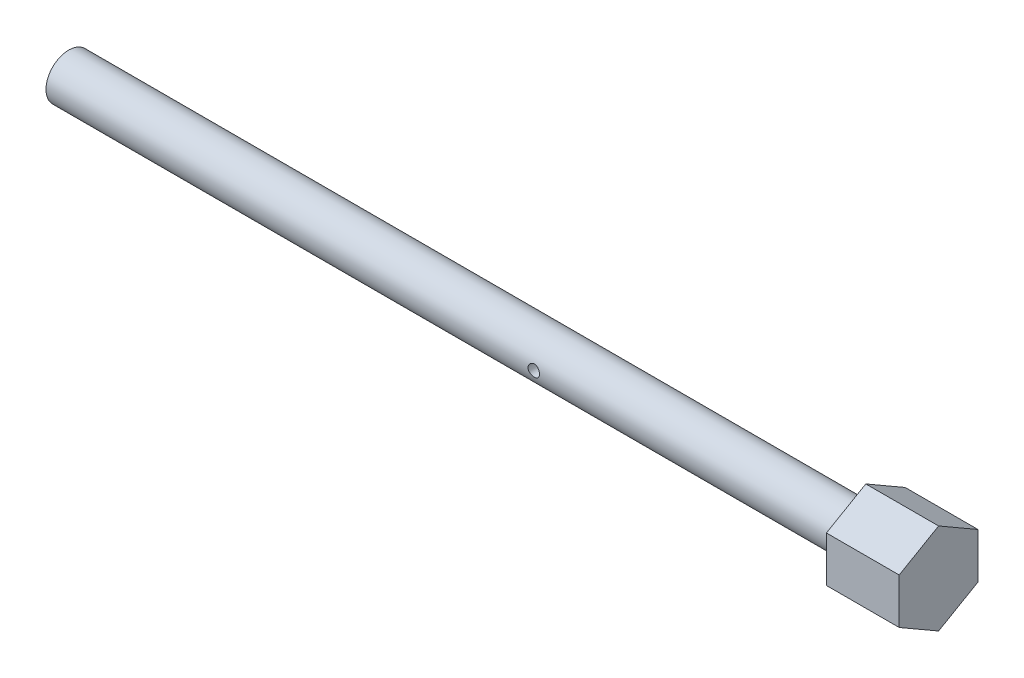
ISO-10303-21;
HEADER;
FILE_DESCRIPTION(('STEP AP214'),'2;1');
FILE_NAME('part.step','',(''),(''),'','','');
FILE_SCHEMA(('AUTOMOTIVE_DESIGN { 1 0 10303 214 1 1 1 1 }'));
ENDSEC;
DATA;
#1=APPLICATION_CONTEXT('core data for automotive mechanical design processes');
#2=APPLICATION_PROTOCOL_DEFINITION('international standard','automotive_design',2000,#1);
#3=PRODUCT_CONTEXT('',#1,'mechanical');
#4=PRODUCT('Part','Part','',(#3));
#5=PRODUCT_RELATED_PRODUCT_CATEGORY('part','',(#4));
#6=PRODUCT_DEFINITION_FORMATION('','',#4);
#7=PRODUCT_DEFINITION_CONTEXT('part definition',#1,'design');
#8=PRODUCT_DEFINITION('design','',#6,#7);
#9=PRODUCT_DEFINITION_SHAPE('','',#8);
#10=(LENGTH_UNIT() NAMED_UNIT(*) SI_UNIT(.MILLI.,.METRE.));
#11=(NAMED_UNIT(*) PLANE_ANGLE_UNIT() SI_UNIT($,.RADIAN.));
#12=(NAMED_UNIT(*) SI_UNIT($,.STERADIAN.) SOLID_ANGLE_UNIT());
#13=UNCERTAINTY_MEASURE_WITH_UNIT(LENGTH_MEASURE(1.E-05),#10,'distance_accuracy_value','');
#14=(GEOMETRIC_REPRESENTATION_CONTEXT(3) GLOBAL_UNCERTAINTY_ASSIGNED_CONTEXT((#13)) GLOBAL_UNIT_ASSIGNED_CONTEXT((#10,
#11,#12)) REPRESENTATION_CONTEXT('',''));
#15=CARTESIAN_POINT('',(0.,0.,0.));
#16=DIRECTION('',(0.,0.,1.));
#17=DIRECTION('',(1.,0.,0.));
#18=AXIS2_PLACEMENT_3D('',#15,#16,#17);
#19=CARTESIAN_POINT('',(14.6981033801855,1.77659923412726,15.8329984353256));
#20=DIRECTION('',(-1.,0.,0.));
#21=DIRECTION('',(0.,0.,1.));
#22=AXIS2_PLACEMENT_3D('',#19,#20,#21);
#23=CYLINDRICAL_SURFACE('',#22,3.175);
#24=CARTESIAN_POINT('',(-27.6817966198145,1.77659923412726,19.0079984353256));
#25=CARTESIAN_POINT('',(-27.6817978390471,1.73240467551193,19.0079976959448));
#26=CARTESIAN_POINT('',(-27.6854706485728,1.68819656561377,19.0070665028199));
#27=CARTESIAN_POINT('',(-27.7000423754133,1.60104811304678,19.0034420433712));
#28=CARTESIAN_POINT('',(-27.7109453158382,1.55810849011355,19.0007477960304));
#29=CARTESIAN_POINT('',(-27.7396046794896,1.47476803314427,18.9938954601907));
#30=CARTESIAN_POINT('',(-27.7573528011809,1.43436419256925,18.989739145358));
#31=CARTESIAN_POINT('',(-27.7991693335304,1.3571072397187,18.9804049255836));
#32=CARTESIAN_POINT('',(-27.8232379821486,1.32025426120011,18.9752269821807));
#33=CARTESIAN_POINT('',(-27.877543672828,1.25037489650321,18.9642902750637));
#34=CARTESIAN_POINT('',(-27.9078879923281,1.21743329587923,18.9585224353417));
#35=CARTESIAN_POINT('',(-27.9736540216734,1.15704878379856,18.947116065746));
#36=CARTESIAN_POINT('',(-28.0090763130379,1.12960650297752,18.9414775507682));
#37=CARTESIAN_POINT('',(-28.0846532578108,1.08059915355741,18.9308765858991));
#38=CARTESIAN_POINT('',(-28.124871378403,1.05912924393719,18.925925649913));
#39=CARTESIAN_POINT('',(-28.2084909863849,1.02328815552088,18.9173928936191));
#40=CARTESIAN_POINT('',(-28.2518919545147,1.0089158217494,18.9138108505754));
#41=CARTESIAN_POINT('',(-28.339712173725,0.98796771421763,18.9085147826809));
#42=CARTESIAN_POINT('',(-28.384092772437,0.981239343774633,18.90676425367));
#43=CARTESIAN_POINT('',(-28.4733846791133,0.975294791117721,18.9052201712187));
#44=CARTESIAN_POINT('',(-28.51829589803,0.97607736582794,18.9054262939488));
#45=CARTESIAN_POINT('',(-28.6062021550469,0.985010809508278,18.9077394288412));
#46=CARTESIAN_POINT('',(-28.6492171355835,0.992979516074041,18.9097994437559));
#47=CARTESIAN_POINT('',(-28.7332791128809,1.01576829565128,18.9155133120664));
#48=CARTESIAN_POINT('',(-28.7743259671999,1.03058886373795,18.9191672806308));
#49=CARTESIAN_POINT('',(-28.8537733877439,1.06681510349828,18.9277002705129));
#50=CARTESIAN_POINT('',(-28.8921425685266,1.08828662263676,18.9325914477408));
#51=CARTESIAN_POINT('',(-28.9647984905788,1.13715922829152,18.9430409184302));
#52=CARTESIAN_POINT('',(-28.9990845052522,1.16456136772003,18.9485993302731));
#53=CARTESIAN_POINT('',(-29.0636443809639,1.22545952560129,18.9599545957391));
#54=CARTESIAN_POINT('',(-29.0937731111056,1.25910917923157,18.9657536903337));
#55=CARTESIAN_POINT('',(-29.1479877635383,1.33105306755705,18.9767916933432));
#56=CARTESIAN_POINT('',(-29.1720734953628,1.36934744859092,18.9820305840982));
#57=CARTESIAN_POINT('',(-29.2135729684709,1.44970289394199,18.9913846597684));
#58=CARTESIAN_POINT('',(-29.2309628218646,1.4917767956762,18.9954958066759));
#59=CARTESIAN_POINT('',(-29.2583822451453,1.57837751068129,19.0021018362174));
#60=CARTESIAN_POINT('',(-29.2684132462446,1.6229038451701,19.0045970331242));
#61=CARTESIAN_POINT('',(-29.2806078495556,1.71190490667094,19.0076433952984));
#62=CARTESIAN_POINT('',(-29.2829690527158,1.75635092818232,19.0082433765333));
#63=CARTESIAN_POINT('',(-29.2802994373727,1.84500315481906,19.0075708959689));
#64=CARTESIAN_POINT('',(-29.2752692956889,1.8892093815302,19.006298605612));
#65=CARTESIAN_POINT('',(-29.258122565175,1.97543833840719,19.002055850403));
#66=CARTESIAN_POINT('',(-29.2461140586694,2.01748395170553,18.9991113012986));
#67=CARTESIAN_POINT('',(-29.2154751706482,2.09896154351387,18.991856145349));
#68=CARTESIAN_POINT('',(-29.1968441142331,2.1383932551569,18.9875453992805));
#69=CARTESIAN_POINT('',(-29.153107964914,2.21430776127608,18.9779194007847));
#70=CARTESIAN_POINT('',(-29.1278925676827,2.25072484373873,18.9725874920064));
#71=CARTESIAN_POINT('',(-29.071844227576,2.31888081040447,18.9615364061962));
#72=CARTESIAN_POINT('',(-29.0410102988119,2.3506188718046,18.955817161309));
#73=CARTESIAN_POINT('',(-28.9736821089577,2.40933233388904,18.9444598173371));
#74=CARTESIAN_POINT('',(-28.9370657345792,2.43616902257577,18.9388273103972));
#75=CARTESIAN_POINT('',(-28.85973292755,2.48331711894506,18.9284402360783));
#76=CARTESIAN_POINT('',(-28.8190166762678,2.50362881511078,18.9236856298894));
#77=CARTESIAN_POINT('',(-28.7348569830842,2.53699871642256,18.9156454102813));
#78=CARTESIAN_POINT('',(-28.6914314414627,2.55009986677109,18.9123511227546));
#79=CARTESIAN_POINT('',(-28.6028982023067,2.56878877708902,18.9075968593495));
#80=CARTESIAN_POINT('',(-28.5577908820351,2.57437821181644,18.906136474602));
#81=CARTESIAN_POINT('',(-28.4685870327308,2.57779646596935,18.9052468861667));
#82=CARTESIAN_POINT('',(-28.4244994487474,2.57584712888928,18.9057596173568));
#83=CARTESIAN_POINT('',(-28.33730338016,2.56475170284712,18.90862404114));
#84=CARTESIAN_POINT('',(-28.2941948752829,2.55560576304041,18.9109756956201));
#85=CARTESIAN_POINT('',(-28.2104263030889,2.53049880921435,18.9172203689061));
#86=CARTESIAN_POINT('',(-28.1697528132891,2.51458003599629,18.921103823417));
#87=CARTESIAN_POINT('',(-28.0916246579741,2.47641262077734,18.9299757364803));
#88=CARTESIAN_POINT('',(-28.0541704469433,2.45416308693064,18.9349643507001));
#89=CARTESIAN_POINT('',(-27.9824735462293,2.40327294853659,18.9456495420113));
#90=CARTESIAN_POINT('',(-27.9483421612427,2.37447870851489,18.9513613680832));
#91=CARTESIAN_POINT('',(-27.8853235435881,2.31161507496293,18.9627590771974));
#92=CARTESIAN_POINT('',(-27.8564375611197,2.27754442741917,18.968444953741));
#93=CARTESIAN_POINT('',(-27.8042086154709,2.20433506599187,18.9792755617626));
#94=CARTESIAN_POINT('',(-27.7809779744296,2.16511431688688,18.9844083485618));
#95=CARTESIAN_POINT('',(-27.7414767811542,2.08319811182505,18.9934279204829));
#96=CARTESIAN_POINT('',(-27.7252013016456,2.04050514131642,18.9973155871995));
#97=CARTESIAN_POINT('',(-27.7024543440952,1.96101459209114,19.002840492422));
#98=CARTESIAN_POINT('',(-27.6947245850974,1.9245916549149,19.0047613415353));
#99=CARTESIAN_POINT('',(-27.6843954092855,1.8509820499073,19.0073405750654));
#100=CARTESIAN_POINT('',(-27.6817955936513,1.81379544167356,19.007999057623));
#101=CARTESIAN_POINT('',(-27.6817966198145,1.77659923412726,19.0079984353256));
#102=B_SPLINE_CURVE_WITH_KNOTS('',3,(#24,#25,#26,#27,#28,#29,#30,#31,#32,#33,#34,#35,#36,#37,
#38,#39,#40,#41,#42,#43,#44,#45,#46,#47,#48,#49,#50,#51,#52,#53,#54,#55,#56,#57,#58,#59,#60,#61,
#62,#63,#64,#65,#66,#67,#68,#69,#70,#71,#72,#73,#74,#75,#76,#77,#78,#79,#80,#81,#82,#83,#84,#85,
#86,#87,#88,#89,#90,#91,#92,#93,#94,#95,#96,#97,#98,#99,#100,#101),.UNSPECIFIED.,.T.,.F.,(4,2,2,
2,2,2,2,2,2,2,2,2,2,2,2,2,2,2,2,2,2,2,2,2,2,2,2,2,2,2,2,2,2,2,2,2,2,2,4),(0.,0.132447354071684,
0.264968468619232,0.397329370188535,0.529695255695682,0.664545055282164,0.799410309959519,
0.936315166227554,1.07319773687421,1.20729686173983,1.34137379332515,1.47214467066986,
1.60292499822566,1.73504389286222,1.86718626293193,2.00315952635134,2.139137074913,
2.27559533237844,2.41202704323488,2.5449146955339,2.67779018017591,2.80866052908661,
2.9395442187261,3.07277948800678,3.20603815875273,3.34262429115238,3.47920438397045,
3.61496196666795,3.75068927680842,3.88245336221338,4.01421471677338,4.145166078079,
4.27613589629705,4.41057382248032,4.54504374892683,4.68199913280023,4.81885733129726,
4.93033988654635,5.0418137744041),.UNSPECIFIED.);
#103=CARTESIAN_POINT('',(-27.6817966198145,1.77659923412726,19.0079984353256));
#104=VERTEX_POINT('',#103);
#105=EDGE_CURVE('E165',#104,#104,#102,.T.);
#106=ORIENTED_EDGE('',*,*,#105,.T.);
#107=EDGE_LOOP('',(#106));
#108=FACE_BOUND('',#107,.T.);
#109=CARTESIAN_POINT('',(14.6981033801855,1.77659923412726,15.8329984353256));
#110=DIRECTION('',(1.,0.,0.));
#111=DIRECTION('',(0.,0.,-1.));
#112=AXIS2_PLACEMENT_3D('',#109,#110,#111);
#113=CIRCLE('',#112,3.175);
#114=CARTESIAN_POINT('',(14.6981033801855,1.77659923412726,12.6579984353256));
#115=VERTEX_POINT('',#114);
#116=EDGE_CURVE('E11',#115,#115,#113,.T.);
#117=ORIENTED_EDGE('',*,*,#116,.F.);
#118=EDGE_LOOP('',(#117));
#119=FACE_BOUND('',#118,.T.);
#120=CARTESIAN_POINT('',(-96.5538966198145,1.77659923412726,15.8329984353256));
#121=DIRECTION('',(-1.,0.,0.));
#122=DIRECTION('',(0.,0.,1.));
#123=AXIS2_PLACEMENT_3D('',#120,#121,#122);
#124=CIRCLE('',#123,3.175);
#125=CARTESIAN_POINT('',(-96.5538966198145,1.77659923412726,19.0079984353256));
#126=VERTEX_POINT('',#125);
#127=EDGE_CURVE('E162',#126,#126,#124,.T.);
#128=ORIENTED_EDGE('',*,*,#127,.F.);
#129=EDGE_LOOP('',(#128));
#130=FACE_BOUND('',#129,.T.);
#131=ADVANCED_FACE('F35',(#108,#119,#130),#23,.T.);
#132=CARTESIAN_POINT('',(24.8581033801855,8.12659923412726,15.8329984353256));
#133=DIRECTION('',(0.,-0.866025403784439,-0.5));
#134=DIRECTION('',(0.,0.5,-0.866025403784439));
#135=AXIS2_PLACEMENT_3D('',#132,#133,#134);
#136=PLANE('',#135);
#137=DIRECTION('',(0.,-0.5,0.866025403784439));
#138=VECTOR('',#137,1.);
#139=CARTESIAN_POINT('',(14.6981033801855,8.12659923412726,15.8329984353256));
#140=LINE('',#139,#138);
#141=CARTESIAN_POINT('',(14.6981033801855,8.12659923412726,15.8329984353256));
#142=VERTEX_POINT('',#141);
#143=CARTESIAN_POINT('',(14.6981033801855,4.95159923412726,21.3322597493567));
#144=VERTEX_POINT('',#143);
#145=EDGE_CURVE('E127',#142,#144,#140,.T.);
#146=ORIENTED_EDGE('',*,*,#145,.T.);
#147=DIRECTION('',(-1.,0.,0.));
#148=VECTOR('',#147,1.);
#149=CARTESIAN_POINT('',(24.8581033801855,4.95159923412726,21.3322597493567));
#150=LINE('',#149,#148);
#151=CARTESIAN_POINT('',(24.8581033801855,4.95159923412726,21.3322597493567));
#152=VERTEX_POINT('',#151);
#153=EDGE_CURVE('E50',#152,#144,#150,.T.);
#154=ORIENTED_EDGE('',*,*,#153,.F.);
#155=DIRECTION('',(0.,-0.5,0.866025403784439));
#156=VECTOR('',#155,1.);
#157=CARTESIAN_POINT('',(24.8581033801855,8.12659923412726,15.8329984353256));
#158=LINE('',#157,#156);
#159=CARTESIAN_POINT('',(24.8581033801855,8.12659923412726,15.8329984353256));
#160=VERTEX_POINT('',#159);
#161=EDGE_CURVE('E138',#160,#152,#158,.T.);
#162=ORIENTED_EDGE('',*,*,#161,.F.);
#163=DIRECTION('',(-1.,0.,0.));
#164=VECTOR('',#163,1.);
#165=CARTESIAN_POINT('',(24.8581033801855,8.12659923412726,15.8329984353256));
#166=LINE('',#165,#164);
#167=EDGE_CURVE('E123',#160,#142,#166,.T.);
#168=ORIENTED_EDGE('',*,*,#167,.T.);
#169=EDGE_LOOP('',(#146,#154,#162,#168));
#170=FACE_BOUND('',#169,.T.);
#171=ADVANCED_FACE('F150',(#170),#136,.F.);
#172=CARTESIAN_POINT('',(24.8581033801855,4.95159923412726,21.3322597493567));
#173=DIRECTION('',(0.,0.,-1.));
#174=DIRECTION('',(-1.,0.,0.));
#175=AXIS2_PLACEMENT_3D('',#172,#173,#174);
#176=PLANE('',#175);
#177=DIRECTION('',(0.,-1.,0.));
#178=VECTOR('',#177,1.);
#179=CARTESIAN_POINT('',(14.6981033801855,4.95159923412726,21.3322597493567));
#180=LINE('',#179,#178);
#181=CARTESIAN_POINT('',(14.6981033801855,-1.39840076587274,21.3322597493567));
#182=VERTEX_POINT('',#181);
#183=EDGE_CURVE('E130',#144,#182,#180,.T.);
#184=ORIENTED_EDGE('',*,*,#183,.T.);
#185=DIRECTION('',(-1.,0.,0.));
#186=VECTOR('',#185,1.);
#187=CARTESIAN_POINT('',(24.8581033801855,-1.39840076587274,21.3322597493567));
#188=LINE('',#187,#186);
#189=CARTESIAN_POINT('',(24.8581033801855,-1.39840076587274,21.3322597493567));
#190=VERTEX_POINT('',#189);
#191=EDGE_CURVE('E142',#190,#182,#188,.T.);
#192=ORIENTED_EDGE('',*,*,#191,.F.);
#193=DIRECTION('',(0.,-1.,0.));
#194=VECTOR('',#193,1.);
#195=CARTESIAN_POINT('',(24.8581033801855,4.95159923412726,21.3322597493567));
#196=LINE('',#195,#194);
#197=EDGE_CURVE('E96',#152,#190,#196,.T.);
#198=ORIENTED_EDGE('',*,*,#197,.F.);
#199=ORIENTED_EDGE('',*,*,#153,.T.);
#200=EDGE_LOOP('',(#184,#192,#198,#199));
#201=FACE_BOUND('',#200,.T.);
#202=ADVANCED_FACE('F146',(#201),#176,.F.);
#203=CARTESIAN_POINT('',(24.8581033801855,-1.39840076587274,21.3322597493567));
#204=DIRECTION('',(0.,0.866025403784438,-0.5));
#205=DIRECTION('',(0.,0.5,0.866025403784439));
#206=AXIS2_PLACEMENT_3D('',#203,#204,#205);
#207=PLANE('',#206);
#208=DIRECTION('',(0.,-0.5,-0.866025403784438));
#209=VECTOR('',#208,1.);
#210=CARTESIAN_POINT('',(14.6981033801855,-1.39840076587274,21.3322597493567));
#211=LINE('',#210,#209);
#212=CARTESIAN_POINT('',(14.6981033801855,-4.57340076587274,15.8329984353256));
#213=VERTEX_POINT('',#212);
#214=EDGE_CURVE('E133',#182,#213,#211,.T.);
#215=ORIENTED_EDGE('',*,*,#214,.T.);
#216=DIRECTION('',(-1.,0.,0.));
#217=VECTOR('',#216,1.);
#218=CARTESIAN_POINT('',(24.8581033801855,-4.57340076587274,15.8329984353256));
#219=LINE('',#218,#217);
#220=CARTESIAN_POINT('',(24.8581033801855,-4.57340076587274,15.8329984353256));
#221=VERTEX_POINT('',#220);
#222=EDGE_CURVE('E118',#221,#213,#219,.T.);
#223=ORIENTED_EDGE('',*,*,#222,.F.);
#224=DIRECTION('',(0.,-0.5,-0.866025403784438));
#225=VECTOR('',#224,1.);
#226=CARTESIAN_POINT('',(24.8581033801855,-1.39840076587274,21.3322597493567));
#227=LINE('',#226,#225);
#228=EDGE_CURVE('E109',#190,#221,#227,.T.);
#229=ORIENTED_EDGE('',*,*,#228,.F.);
#230=ORIENTED_EDGE('',*,*,#191,.T.);
#231=EDGE_LOOP('',(#215,#223,#229,#230));
#232=FACE_BOUND('',#231,.T.);
#233=ADVANCED_FACE('F155',(#232),#207,.F.);
#234=CARTESIAN_POINT('',(24.8581033801855,-4.57340076587274,15.8329984353256));
#235=DIRECTION('',(0.,0.866025403784438,0.5));
#236=DIRECTION('',(0.,-0.5,0.866025403784439));
#237=AXIS2_PLACEMENT_3D('',#234,#235,#236);
#238=PLANE('',#237);
#239=DIRECTION('',(0.,0.5,-0.866025403784439));
#240=VECTOR('',#239,1.);
#241=CARTESIAN_POINT('',(14.6981033801855,-4.57340076587274,15.8329984353256));
#242=LINE('',#241,#240);
#243=CARTESIAN_POINT('',(14.6981033801855,-1.39840076587274,10.3337371212944));
#244=VERTEX_POINT('',#243);
#245=EDGE_CURVE('E117',#213,#244,#242,.T.);
#246=ORIENTED_EDGE('',*,*,#245,.T.);
#247=DIRECTION('',(-1.,0.,0.));
#248=VECTOR('',#247,1.);
#249=CARTESIAN_POINT('',(24.8581033801855,-1.39840076587274,10.3337371212944));
#250=LINE('',#249,#248);
#251=CARTESIAN_POINT('',(24.8581033801855,-1.39840076587274,10.3337371212944));
#252=VERTEX_POINT('',#251);
#253=EDGE_CURVE('E114',#252,#244,#250,.T.);
#254=ORIENTED_EDGE('',*,*,#253,.F.);
#255=DIRECTION('',(0.,0.5,-0.866025403784439));
#256=VECTOR('',#255,1.);
#257=CARTESIAN_POINT('',(24.8581033801855,-4.57340076587274,15.8329984353256));
#258=LINE('',#257,#256);
#259=EDGE_CURVE('E103',#221,#252,#258,.T.);
#260=ORIENTED_EDGE('',*,*,#259,.F.);
#261=ORIENTED_EDGE('',*,*,#222,.T.);
#262=EDGE_LOOP('',(#246,#254,#260,#261));
#263=FACE_BOUND('',#262,.T.);
#264=ADVANCED_FACE('F115',(#263),#238,.F.);
#265=CARTESIAN_POINT('',(24.8581033801855,-1.39840076587274,10.3337371212944));
#266=DIRECTION('',(0.,0.,1.));
#267=DIRECTION('',(1.,0.,0.));
#268=AXIS2_PLACEMENT_3D('',#265,#266,#267);
#269=PLANE('',#268);
#270=DIRECTION('',(0.,1.,0.));
#271=VECTOR('',#270,1.);
#272=CARTESIAN_POINT('',(14.6981033801855,-1.39840076587274,10.3337371212944));
#273=LINE('',#272,#271);
#274=CARTESIAN_POINT('',(14.6981033801855,4.95159923412726,10.3337371212944));
#275=VERTEX_POINT('',#274);
#276=EDGE_CURVE('E81',#244,#275,#273,.T.);
#277=ORIENTED_EDGE('',*,*,#276,.T.);
#278=DIRECTION('',(-1.,0.,0.));
#279=VECTOR('',#278,1.);
#280=CARTESIAN_POINT('',(24.8581033801855,4.95159923412726,10.3337371212944));
#281=LINE('',#280,#279);
#282=CARTESIAN_POINT('',(24.8581033801855,4.95159923412726,10.3337371212944));
#283=VERTEX_POINT('',#282);
#284=EDGE_CURVE('E119',#283,#275,#281,.T.);
#285=ORIENTED_EDGE('',*,*,#284,.F.);
#286=DIRECTION('',(0.,1.,0.));
#287=VECTOR('',#286,1.);
#288=CARTESIAN_POINT('',(24.8581033801855,-1.39840076587274,10.3337371212944));
#289=LINE('',#288,#287);
#290=EDGE_CURVE('E107',#252,#283,#289,.T.);
#291=ORIENTED_EDGE('',*,*,#290,.F.);
#292=ORIENTED_EDGE('',*,*,#253,.T.);
#293=EDGE_LOOP('',(#277,#285,#291,#292));
#294=FACE_BOUND('',#293,.T.);
#295=ADVANCED_FACE('F121',(#294),#269,.F.);
#296=CARTESIAN_POINT('',(24.8581033801855,4.95159923412726,10.3337371212944));
#297=DIRECTION('',(0.,-0.866025403784439,0.5));
#298=DIRECTION('',(0.,-0.5,-0.866025403784439));
#299=AXIS2_PLACEMENT_3D('',#296,#297,#298);
#300=PLANE('',#299);
#301=DIRECTION('',(0.,0.5,0.866025403784439));
#302=VECTOR('',#301,1.);
#303=CARTESIAN_POINT('',(14.6981033801855,4.95159923412726,10.3337371212944));
#304=LINE('',#303,#302);
#305=EDGE_CURVE('E87',#275,#142,#304,.T.);
#306=ORIENTED_EDGE('',*,*,#305,.T.);
#307=ORIENTED_EDGE('',*,*,#167,.F.);
#308=DIRECTION('',(0.,0.5,0.866025403784439));
#309=VECTOR('',#308,1.);
#310=CARTESIAN_POINT('',(24.8581033801855,4.95159923412726,10.3337371212944));
#311=LINE('',#310,#309);
#312=EDGE_CURVE('E58',#283,#160,#311,.T.);
#313=ORIENTED_EDGE('',*,*,#312,.F.);
#314=ORIENTED_EDGE('',*,*,#284,.T.);
#315=EDGE_LOOP('',(#306,#307,#313,#314));
#316=FACE_BOUND('',#315,.T.);
#317=ADVANCED_FACE('F190',(#316),#300,.F.);
#318=CARTESIAN_POINT('',(24.8581033801855,1.77659923412726,15.8329984353256));
#319=DIRECTION('',(1.,0.,0.));
#320=DIRECTION('',(0.,0.,-1.));
#321=AXIS2_PLACEMENT_3D('',#318,#319,#320);
#322=PLANE('',#321);
#323=ORIENTED_EDGE('',*,*,#161,.T.);
#324=ORIENTED_EDGE('',*,*,#197,.T.);
#325=ORIENTED_EDGE('',*,*,#228,.T.);
#326=ORIENTED_EDGE('',*,*,#259,.T.);
#327=ORIENTED_EDGE('',*,*,#290,.T.);
#328=ORIENTED_EDGE('',*,*,#312,.T.);
#329=EDGE_LOOP('',(#323,#324,#325,#326,#327,#328));
#330=FACE_BOUND('',#329,.T.);
#331=ADVANCED_FACE('F105',(#330),#322,.T.);
#332=CARTESIAN_POINT('',(14.6981033801855,1.77659923412726,15.8329984353256));
#333=DIRECTION('',(1.,0.,0.));
#334=DIRECTION('',(0.,0.,-1.));
#335=AXIS2_PLACEMENT_3D('',#332,#333,#334);
#336=PLANE('',#335);
#337=ORIENTED_EDGE('',*,*,#116,.T.);
#338=EDGE_LOOP('',(#337));
#339=FACE_BOUND('',#338,.T.);
#340=ORIENTED_EDGE('',*,*,#145,.F.);
#341=ORIENTED_EDGE('',*,*,#305,.F.);
#342=ORIENTED_EDGE('',*,*,#276,.F.);
#343=ORIENTED_EDGE('',*,*,#245,.F.);
#344=ORIENTED_EDGE('',*,*,#214,.F.);
#345=ORIENTED_EDGE('',*,*,#183,.F.);
#346=EDGE_LOOP('',(#340,#341,#342,#343,#344,#345));
#347=FACE_BOUND('',#346,.T.);
#348=ADVANCED_FACE('F152',(#339,#347),#336,.F.);
#349=CARTESIAN_POINT('',(14.6981033801855,1.77659923412726,15.8329984353256));
#350=DIRECTION('',(-1.,0.,0.));
#351=DIRECTION('',(0.,0.,1.));
#352=AXIS2_PLACEMENT_3D('',#349,#350,#351);
#353=CYLINDRICAL_SURFACE('',#352,0.866025403784435);
#354=CARTESIAN_POINT('',(-27.6817966198145,1.77659923412726,16.69902383911));
#355=CARTESIAN_POINT('',(-27.6817992199156,1.81334570088443,16.6990212663805));
#356=CARTESIAN_POINT('',(-27.684348962778,1.85011446001101,16.6966641051312));
#357=CARTESIAN_POINT('',(-27.6943456998661,1.92240694534465,16.6874414521935));
#358=CARTESIAN_POINT('',(-27.7017980544362,1.95792926390704,16.6805710258705));
#359=CARTESIAN_POINT('',(-27.7209914514379,2.0264855921892,16.6629396202665));
#360=CARTESIAN_POINT('',(-27.7327043450286,2.0595342554597,16.6522041812939));
#361=CARTESIAN_POINT('',(-27.7597563143139,2.1228068674827,16.6275397333627));
#362=CARTESIAN_POINT('',(-27.7750967743435,2.15302973170771,16.6136095052849));
#363=CARTESIAN_POINT('',(-27.8155606772005,2.22194600254762,16.577134097595));
#364=CARTESIAN_POINT('',(-27.8421354017452,2.25914560953122,16.5533793164494));
#365=CARTESIAN_POINT('',(-27.8998198204221,2.32737368923016,16.5026708213655));
#366=CARTESIAN_POINT('',(-27.9309400818038,2.35838737255607,16.475709681338));
#367=CARTESIAN_POINT('',(-27.9976902621772,2.41508933964976,16.4194828495911));
#368=CARTESIAN_POINT('',(-28.0334130176899,2.44062616110373,16.390176542457));
#369=CARTESIAN_POINT('',(-28.1085140057142,2.48558939746924,16.3316726552763));
#370=CARTESIAN_POINT('',(-28.1478847908613,2.50502792079538,16.3024749749864));
#371=CARTESIAN_POINT('',(-28.2097943452306,2.52932025598611,16.2615515032613));
#372=CARTESIAN_POINT('',(-28.2305805482861,2.53653443143424,16.2485604606472));
#373=CARTESIAN_POINT('',(-28.2735222610712,2.54941475002249,16.2240808485826));
#374=CARTESIAN_POINT('',(-28.2956780688673,2.5550805547266,16.2125926078934));
#375=CARTESIAN_POINT('',(-28.3379196816642,2.56388457531249,16.1939295506773));
#376=CARTESIAN_POINT('',(-28.3577704156329,2.5672820299553,16.1863588021474));
#377=CARTESIAN_POINT('',(-28.398536563635,2.57260781193867,16.1741958237325));
#378=CARTESIAN_POINT('',(-28.4194479099581,2.57454135729575,16.1695930235624));
#379=CARTESIAN_POINT('',(-28.4585870968215,2.57656088844711,16.1647626994359));
#380=CARTESIAN_POINT('',(-28.4767295798377,2.57688643232396,16.1639684408618));
#381=CARTESIAN_POINT('',(-28.512877312039,2.57630381580734,16.1653732150968));
#382=CARTESIAN_POINT('',(-28.5308825037507,2.57539516450758,16.1675734389745));
#383=CARTESIAN_POINT('',(-28.5719173599195,2.5719644525906,16.1756612342493));
#384=CARTESIAN_POINT('',(-28.5947162588179,2.569019964538,16.1825016477706));
#385=CARTESIAN_POINT('',(-28.6389343902232,2.56146004077281,16.1991648097161));
#386=CARTESIAN_POINT('',(-28.6603467400798,2.55683692543506,16.2090012308274));
#387=CARTESIAN_POINT('',(-28.7226086110634,2.54083881613415,16.2410361178286));
#388=CARTESIAN_POINT('',(-28.7615604197327,2.52732682270495,16.2657843881268));
#389=CARTESIAN_POINT('',(-28.8358861083778,2.49526727563073,16.3172057075496));
#390=CARTESIAN_POINT('',(-28.8712520818797,2.47670891298101,16.3438827969909));
#391=CARTESIAN_POINT('',(-28.9435695144114,2.43163541446983,16.4008174175752));
#392=CARTESIAN_POINT('',(-28.9800749609742,2.40437872115116,16.4310650245377));
#393=CARTESIAN_POINT('',(-29.0487908524189,2.34308122525399,16.4894195965652));
#394=CARTESIAN_POINT('',(-29.0810090507928,2.30905295516574,16.5175303854608));
#395=CARTESIAN_POINT('',(-29.1335869897977,2.24226564062617,16.5640432355177));
#396=CARTESIAN_POINT('',(-29.1549955326285,2.2108784461187,16.5832198545918));
#397=CARTESIAN_POINT('',(-29.193733464213,2.14393900807818,16.6181619876909));
#398=CARTESIAN_POINT('',(-29.2110673778874,2.10839145104142,16.6339312839972));
#399=CARTESIAN_POINT('',(-29.2382547129353,2.03969064236005,16.6587661951783));
#400=CARTESIAN_POINT('',(-29.2488651785439,2.00708299004215,16.6685040559914));
#401=CARTESIAN_POINT('',(-29.2659158596245,1.93991351294122,16.6841828014179));
#402=CARTESIAN_POINT('',(-29.272358802241,1.90535298221852,16.6901261690394));
#403=CARTESIAN_POINT('',(-29.2806451956545,1.83505985837859,16.697773949144));
#404=CARTESIAN_POINT('',(-29.2824689912823,1.79932290995309,16.6994602470533));
#405=CARTESIAN_POINT('',(-29.2813149405311,1.72799458186887,16.6983940585729));
#406=CARTESIAN_POINT('',(-29.2783372421594,1.692403197757,16.6956417090057));
#407=CARTESIAN_POINT('',(-29.2681749636289,1.62490071062573,16.6862686944952));
#408=CARTESIAN_POINT('',(-29.2612909102838,1.59290409740055,16.6799244365993));
#409=CARTESIAN_POINT('',(-29.2439703867096,1.53074080123634,16.6640127583565));
#410=CARTESIAN_POINT('',(-29.2335327281349,1.50057473442346,16.6544442598164));
#411=CARTESIAN_POINT('',(-29.2054984704132,1.43260130162672,16.6288602327506));
#412=CARTESIAN_POINT('',(-29.1866743442538,1.39570871481035,16.6117589880266));
#413=CARTESIAN_POINT('',(-29.1446572563984,1.32653915433261,16.5739487527749));
#414=CARTESIAN_POINT('',(-29.1214553933799,1.29427182473183,16.5532324181911));
#415=CARTESIAN_POINT('',(-29.0632929338717,1.22448104024874,16.5020357526377));
#416=CARTESIAN_POINT('',(-29.0269894501205,1.18878512206622,16.4706011585426));
#417=CARTESIAN_POINT('',(-28.9494969114486,1.12542476463524,16.4057292523146));
#418=CARTESIAN_POINT('',(-28.9083029265402,1.09776852848513,16.3722899363691));
#419=CARTESIAN_POINT('',(-28.8362798979843,1.05853615666723,16.3178579548128));
#420=CARTESIAN_POINT('',(-28.8068498791037,1.04471643399478,16.2965937109778));
#421=CARTESIAN_POINT('',(-28.7454799153674,1.02044146001194,16.255820268153));
#422=CARTESIAN_POINT('',(-28.7135455166639,1.00997902170793,16.2363073854223));
#423=CARTESIAN_POINT('',(-28.6610274210557,0.996566863928153,16.209389179529));
#424=CARTESIAN_POINT('',(-28.6415889063513,0.992332774551086,16.20042128896));
#425=CARTESIAN_POINT('',(-28.6015408038666,0.985235285268272,16.1848730327657));
#426=CARTESIAN_POINT('',(-28.5809341269072,0.982368632615461,16.1782870104715));
#427=CARTESIAN_POINT('',(-28.542406914973,0.978599144453021,16.1694736561031));
#428=CARTESIAN_POINT('',(-28.5246449304514,0.977440955113463,16.1666863683694));
#429=CARTESIAN_POINT('',(-28.4888732945695,0.976330281866773,16.1640153470417));
#430=CARTESIAN_POINT('',(-28.4708639679422,0.976376344681306,16.1641281136911));
#431=CARTESIAN_POINT('',(-28.4352031483846,0.977663678503436,16.1672199962627));
#432=CARTESIAN_POINT('',(-28.4175507947471,0.978901602725565,16.1701910859032));
#433=CARTESIAN_POINT('',(-28.382909392104,0.982454424263237,16.1784752814781));
#434=CARTESIAN_POINT('',(-28.3659217690875,0.984771512556276,16.1837931508141));
#435=CARTESIAN_POINT('',(-28.3180897889462,0.99280454558293,16.2015404655093));
#436=CARTESIAN_POINT('',(-28.2882604318981,0.999714838831308,16.2161023806213));
#437=CARTESIAN_POINT('',(-28.2309269912594,1.01628951441972,16.2480387762689));
#438=CARTESIAN_POINT('',(-28.2034353644332,1.02596758105422,16.2654270416002));
#439=CARTESIAN_POINT('',(-28.1520253415229,1.04717163593919,16.3002510415673));
#440=CARTESIAN_POINT('',(-28.127990860358,1.0585394782106,16.3176123407692));
#441=CARTESIAN_POINT('',(-28.081340275515,1.08347970380178,16.3526618977652));
#442=CARTESIAN_POINT('',(-28.058725237659,1.09705371686321,16.3703503886358));
#443=CARTESIAN_POINT('',(-27.9929565737221,1.14108256551168,16.4230888616025));
#444=CARTESIAN_POINT('',(-27.9517526697647,1.17489679544282,16.4579042758335));
#445=CARTESIAN_POINT('',(-27.8854504900911,1.24179952901932,16.5152005220436));
#446=CARTESIAN_POINT('',(-27.8589520619281,1.27278478652017,16.538532735071));
#447=CARTESIAN_POINT('',(-27.8101758517679,1.33994477990269,16.5819462670647));
#448=CARTESIAN_POINT('',(-27.7878914217536,1.37611118083535,16.602032699177));
#449=CARTESIAN_POINT('',(-27.752676338816,1.44555104171539,16.633972882566));
#450=CARTESIAN_POINT('',(-27.7387656304821,1.47793685987473,16.6466699891694));
#451=CARTESIAN_POINT('',(-27.7151106048481,1.54536473290521,16.6683294043433));
#452=CARTESIAN_POINT('',(-27.7053596569464,1.58040245489839,16.6772976560745));
#453=CARTESIAN_POINT('',(-27.6926826856278,1.64239561198718,16.6889742091175));
#454=CARTESIAN_POINT('',(-27.6886176415677,1.66892713960366,16.6927253930621));
#455=CARTESIAN_POINT('',(-27.6831735403392,1.72250146670632,16.6977512576353));
#456=CARTESIAN_POINT('',(-27.681794705466,1.74954430831892,16.6990257333059));
#457=CARTESIAN_POINT('',(-27.6817966198145,1.77659923412726,16.69902383911));
#458=B_SPLINE_CURVE_WITH_KNOTS('',3,(#354,#355,#356,#357,#358,#359,#360,#361,#362,#363,#364,
#365,#366,#367,#368,#369,#370,#371,#372,#373,#374,#375,#376,#377,#378,#379,#380,#381,#382,#383,
#384,#385,#386,#387,#388,#389,#390,#391,#392,#393,#394,#395,#396,#397,#398,#399,#400,#401,#402,
#403,#404,#405,#406,#407,#408,#409,#410,#411,#412,#413,#414,#415,#416,#417,#418,#419,#420,#421,
#422,#423,#424,#425,#426,#427,#428,#429,#430,#431,#432,#433,#434,#435,#436,#437,#438,#439,#440,
#441,#442,#443,#444,#445,#446,#447,#448,#449,#450,#451,#452,#453,#454,#455,#456,#457),
.UNSPECIFIED.,.T.,.F.,(4,2,2,2,2,2,2,2,2,2,2,2,2,2,2,2,2,2,2,2,2,2,2,2,2,2,2,2,2,2,2,2,2,2,2,2,
2,2,2,2,2,2,2,2,2,2,2,2,2,2,2,4),(0.,0.110121894925437,0.220364393843474,0.329891384686133,
0.439460240355943,0.593178193373324,0.747259364600528,0.905168880458002,1.06276284670419,
1.13933606304099,1.21592600304986,1.28027555804916,1.34439464882605,1.39859377720772,
1.45281446983363,1.52434284969989,1.59620267830537,1.73968358916147,1.88347428145557,
2.04695436088204,2.21013464742159,2.33736634911677,2.46445608395987,2.57094938904609,
2.67737293633195,2.78424857683407,2.89112092293021,2.99070996195404,3.09033233687655,
3.22402372094984,3.35798992991909,3.53656469548665,3.7153210311421,3.83170189892542,
3.94783193998672,4.01316439330938,4.07834065442703,4.13214649722095,4.18588741071255,
4.23947785677624,4.29317758256122,4.39431223388411,4.49595582091269,4.59108639509614,
4.68628756620751,4.87619897566531,5.01666482679936,5.15690719526299,5.26886514480285,
5.38064396196722,5.46171551626612,5.54279377929396),.UNSPECIFIED.);
#459=CARTESIAN_POINT('',(-27.6817966198145,1.77659923412726,16.69902383911));
#460=VERTEX_POINT('',#459);
#461=EDGE_CURVE('E39',#460,#460,#458,.T.);
#462=ORIENTED_EDGE('',*,*,#461,.T.);
#463=EDGE_LOOP('',(#462));
#464=FACE_BOUND('',#463,.T.);
#465=CARTESIAN_POINT('',(-32.2918966198145,1.77659923412726,15.8329984353256));
#466=DIRECTION('',(-1.,0.,0.));
#467=DIRECTION('',(0.,0.,1.));
#468=AXIS2_PLACEMENT_3D('',#465,#466,#467);
#469=CIRCLE('',#468,0.866025403784435);
#470=CARTESIAN_POINT('',(-32.2918966198145,1.77659923412726,16.69902383911));
#471=VERTEX_POINT('',#470);
#472=EDGE_CURVE('E159',#471,#471,#469,.T.);
#473=ORIENTED_EDGE('',*,*,#472,.T.);
#474=EDGE_LOOP('',(#473));
#475=FACE_BOUND('',#474,.T.);
#476=CARTESIAN_POINT('',(14.6981033801855,1.77659923412726,15.8329984353256));
#477=DIRECTION('',(-1.,0.,0.));
#478=DIRECTION('',(0.,0.,1.));
#479=AXIS2_PLACEMENT_3D('',#476,#477,#478);
#480=CIRCLE('',#479,0.866025403784435);
#481=CARTESIAN_POINT('',(14.6981033801855,1.77659923412726,16.69902383911));
#482=VERTEX_POINT('',#481);
#483=EDGE_CURVE('E131',#482,#482,#480,.T.);
#484=ORIENTED_EDGE('',*,*,#483,.F.);
#485=EDGE_LOOP('',(#484));
#486=FACE_BOUND('',#485,.T.);
#487=ADVANCED_FACE('F182',(#464,#475,#486),#353,.F.);
#488=CARTESIAN_POINT('',(14.6981033801855,1.77659923412726,15.8329984353256));
#489=DIRECTION('',(-1.,0.,0.));
#490=DIRECTION('',(0.,0.,1.));
#491=AXIS2_PLACEMENT_3D('',#488,#489,#490);
#492=PLANE('',#491);
#493=ORIENTED_EDGE('',*,*,#483,.T.);
#494=EDGE_LOOP('',(#493));
#495=FACE_BOUND('',#494,.T.);
#496=ADVANCED_FACE('F177',(#495),#492,.T.);
#497=CARTESIAN_POINT('',(-28.4818966198145,1.77659923412726,15.9982597493567));
#498=DIRECTION('',(0.,0.,1.));
#499=DIRECTION('',(1.,0.,0.));
#500=AXIS2_PLACEMENT_3D('',#497,#498,#499);
#501=CYLINDRICAL_SURFACE('',#500,0.8001);
#502=ORIENTED_EDGE('',*,*,#461,.F.);
#503=EDGE_LOOP('',(#502));
#504=FACE_BOUND('',#503,.T.);
#505=ORIENTED_EDGE('',*,*,#105,.F.);
#506=EDGE_LOOP('',(#505));
#507=FACE_BOUND('',#506,.T.);
#508=ADVANCED_FACE('F171',(#504,#507),#501,.F.);
#509=CARTESIAN_POINT('',(-32.2918966198145,1.77659923412726,15.8329984353256));
#510=DIRECTION('',(-1.,0.,0.));
#511=DIRECTION('',(0.,0.,1.));
#512=AXIS2_PLACEMENT_3D('',#509,#510,#511);
#513=PLANE('',#512);
#514=ORIENTED_EDGE('',*,*,#472,.F.);
#515=EDGE_LOOP('',(#514));
#516=FACE_BOUND('',#515,.T.);
#517=ADVANCED_FACE('F176',(#516),#513,.F.);
#518=CARTESIAN_POINT('',(-96.5538966198145,1.77659923412726,15.8329984353256));
#519=DIRECTION('',(-1.,0.,0.));
#520=DIRECTION('',(0.,0.,1.));
#521=AXIS2_PLACEMENT_3D('',#518,#519,#520);
#522=PLANE('',#521);
#523=ORIENTED_EDGE('',*,*,#127,.T.);
#524=EDGE_LOOP('',(#523));
#525=FACE_BOUND('',#524,.T.);
#526=ADVANCED_FACE('F217',(#525),#522,.T.);
#527=CLOSED_SHELL('',(#131,#171,#202,#233,#264,#295,#317,#331,#348,#487,#496,#508,#517,#526));
#528=MANIFOLD_SOLID_BREP('B2',#527);
#529=ADVANCED_BREP_SHAPE_REPRESENTATION('',(#18,#528),#14);
#530=SHAPE_DEFINITION_REPRESENTATION(#9,#529);
ENDSEC;
END-ISO-10303-21;
